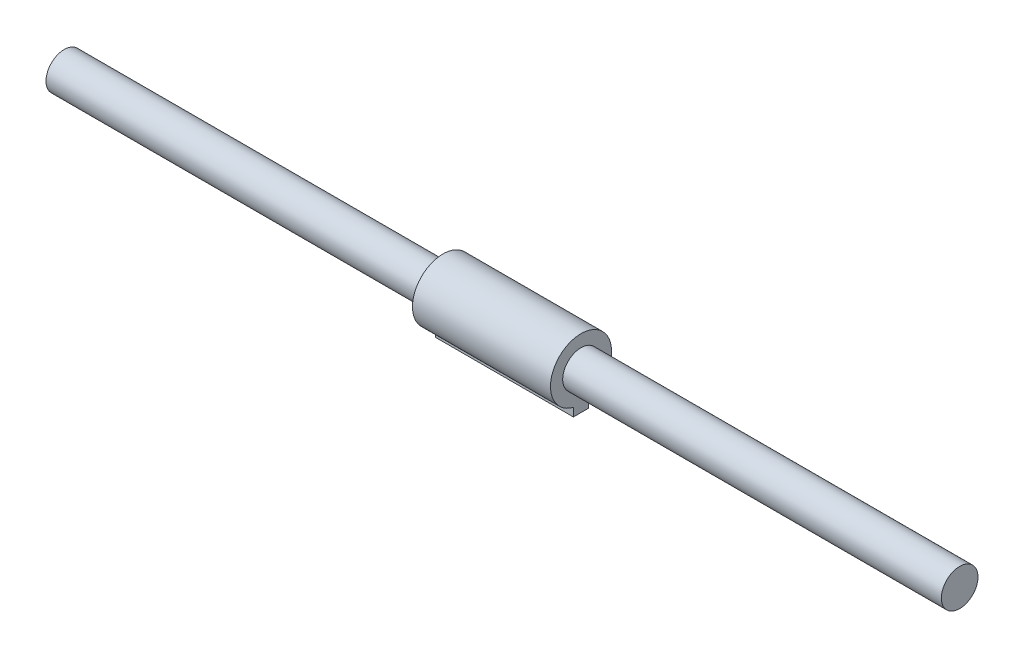
ISO-10303-21;
HEADER;
FILE_DESCRIPTION(('STEP AP214'),'2;1');
FILE_NAME('part.step','',(''),(''),'','','');
FILE_SCHEMA(('AUTOMOTIVE_DESIGN { 1 0 10303 214 1 1 1 1 }'));
ENDSEC;
DATA;
#1=APPLICATION_CONTEXT('core data for automotive mechanical design processes');
#2=APPLICATION_PROTOCOL_DEFINITION('international standard','automotive_design',2000,#1);
#3=PRODUCT_CONTEXT('',#1,'mechanical');
#4=PRODUCT('Part','Part','',(#3));
#5=PRODUCT_RELATED_PRODUCT_CATEGORY('part','',(#4));
#6=PRODUCT_DEFINITION_FORMATION('','',#4);
#7=PRODUCT_DEFINITION_CONTEXT('part definition',#1,'design');
#8=PRODUCT_DEFINITION('design','',#6,#7);
#9=PRODUCT_DEFINITION_SHAPE('','',#8);
#10=(LENGTH_UNIT() NAMED_UNIT(*) SI_UNIT(.MILLI.,.METRE.));
#11=(NAMED_UNIT(*) PLANE_ANGLE_UNIT() SI_UNIT($,.RADIAN.));
#12=(NAMED_UNIT(*) SI_UNIT($,.STERADIAN.) SOLID_ANGLE_UNIT());
#13=UNCERTAINTY_MEASURE_WITH_UNIT(LENGTH_MEASURE(1.E-05),#10,'distance_accuracy_value','');
#14=(GEOMETRIC_REPRESENTATION_CONTEXT(3) GLOBAL_UNCERTAINTY_ASSIGNED_CONTEXT((#13)) GLOBAL_UNIT_ASSIGNED_CONTEXT((#10,
#11,#12)) REPRESENTATION_CONTEXT('',''));
#15=CARTESIAN_POINT('',(0.,0.,0.));
#16=DIRECTION('',(0.,0.,1.));
#17=DIRECTION('',(1.,0.,0.));
#18=AXIS2_PLACEMENT_3D('',#15,#16,#17);
#19=CARTESIAN_POINT('',(28.702,0.,0.));
#20=DIRECTION('',(-1.,0.,0.));
#21=DIRECTION('',(0.,0.,1.));
#22=AXIS2_PLACEMENT_3D('',#19,#20,#21);
#23=CYLINDRICAL_SURFACE('',#22,6.35);
#24=CARTESIAN_POINT('',(0.,0.,0.));
#25=DIRECTION('',(1.,0.,0.));
#26=DIRECTION('',(0.,0.,-1.));
#27=AXIS2_PLACEMENT_3D('',#24,#25,#26);
#28=CIRCLE('',#27,6.35);
#29=CARTESIAN_POINT('',(0.,-6.14836106210427,-1.5875));
#30=VERTEX_POINT('',#29);
#31=CARTESIAN_POINT('',(0.,-6.14836106210427,1.5875));
#32=VERTEX_POINT('',#31);
#33=EDGE_CURVE('E101',#30,#32,#28,.T.);
#34=ORIENTED_EDGE('',*,*,#33,.T.);
#35=DIRECTION('',(-1.,0.,0.));
#36=VECTOR('',#35,1.);
#37=CARTESIAN_POINT('',(28.702,-6.14836106210427,1.5875));
#38=LINE('',#37,#36);
#39=CARTESIAN_POINT('',(28.702,-6.14836106210427,1.5875));
#40=VERTEX_POINT('',#39);
#41=EDGE_CURVE('E43',#40,#32,#38,.T.);
#42=ORIENTED_EDGE('',*,*,#41,.F.);
#43=CARTESIAN_POINT('',(28.702,0.,0.));
#44=DIRECTION('',(1.,0.,0.));
#45=DIRECTION('',(0.,0.,-1.));
#46=AXIS2_PLACEMENT_3D('',#43,#44,#45);
#47=CIRCLE('',#46,6.35);
#48=CARTESIAN_POINT('',(28.702,-6.14836106210427,-1.5875));
#49=VERTEX_POINT('',#48);
#50=EDGE_CURVE('E87',#49,#40,#47,.T.);
#51=ORIENTED_EDGE('',*,*,#50,.F.);
#52=DIRECTION('',(-1.,0.,0.));
#53=VECTOR('',#52,1.);
#54=CARTESIAN_POINT('',(28.702,-6.14836106210427,-1.5875));
#55=LINE('',#54,#53);
#56=EDGE_CURVE('E97',#49,#30,#55,.T.);
#57=ORIENTED_EDGE('',*,*,#56,.T.);
#58=EDGE_LOOP('',(#34,#42,#51,#57));
#59=FACE_BOUND('',#58,.T.);
#60=ADVANCED_FACE('F35',(#59),#23,.T.);
#61=CARTESIAN_POINT('',(28.702,-7.87302106210427,1.5875));
#62=DIRECTION('',(0.,0.,-1.));
#63=DIRECTION('',(0.,1.,0.));
#64=AXIS2_PLACEMENT_3D('',#61,#62,#63);
#65=PLANE('',#64);
#66=DIRECTION('',(0.,-1.,0.));
#67=VECTOR('',#66,1.);
#68=CARTESIAN_POINT('',(0.,-7.87302106210427,1.5875));
#69=LINE('',#68,#67);
#70=CARTESIAN_POINT('',(0.,-7.87302106210427,1.5875));
#71=VERTEX_POINT('',#70);
#72=EDGE_CURVE('E92',#32,#71,#69,.T.);
#73=ORIENTED_EDGE('',*,*,#72,.T.);
#74=DIRECTION('',(-1.,0.,0.));
#75=VECTOR('',#74,1.);
#76=CARTESIAN_POINT('',(28.702,-7.87302106210427,1.5875));
#77=LINE('',#76,#75);
#78=CARTESIAN_POINT('',(28.702,-7.87302106210427,1.5875));
#79=VERTEX_POINT('',#78);
#80=EDGE_CURVE('E90',#79,#71,#77,.T.);
#81=ORIENTED_EDGE('',*,*,#80,.F.);
#82=DIRECTION('',(0.,-1.,0.));
#83=VECTOR('',#82,1.);
#84=CARTESIAN_POINT('',(28.702,-7.87302106210427,1.5875));
#85=LINE('',#84,#83);
#86=EDGE_CURVE('E82',#40,#79,#85,.T.);
#87=ORIENTED_EDGE('',*,*,#86,.F.);
#88=ORIENTED_EDGE('',*,*,#41,.T.);
#89=EDGE_LOOP('',(#73,#81,#87,#88));
#90=FACE_BOUND('',#89,.T.);
#91=ADVANCED_FACE('F91',(#90),#65,.F.);
#92=CARTESIAN_POINT('',(28.702,-7.87302106210427,-1.5875));
#93=DIRECTION('',(0.,1.,0.));
#94=DIRECTION('',(0.,0.,1.));
#95=AXIS2_PLACEMENT_3D('',#92,#93,#94);
#96=PLANE('',#95);
#97=DIRECTION('',(0.,0.,-1.));
#98=VECTOR('',#97,1.);
#99=CARTESIAN_POINT('',(0.,-7.87302106210427,-1.5875));
#100=LINE('',#99,#98);
#101=CARTESIAN_POINT('',(0.,-7.87302106210427,-1.5875));
#102=VERTEX_POINT('',#101);
#103=EDGE_CURVE('E68',#71,#102,#100,.T.);
#104=ORIENTED_EDGE('',*,*,#103,.T.);
#105=DIRECTION('',(-1.,0.,0.));
#106=VECTOR('',#105,1.);
#107=CARTESIAN_POINT('',(28.702,-7.87302106210427,-1.5875));
#108=LINE('',#107,#106);
#109=CARTESIAN_POINT('',(28.702,-7.87302106210427,-1.5875));
#110=VERTEX_POINT('',#109);
#111=EDGE_CURVE('E93',#110,#102,#108,.T.);
#112=ORIENTED_EDGE('',*,*,#111,.F.);
#113=DIRECTION('',(0.,0.,-1.));
#114=VECTOR('',#113,1.);
#115=CARTESIAN_POINT('',(28.702,-7.87302106210427,-1.5875));
#116=LINE('',#115,#114);
#117=EDGE_CURVE('E85',#79,#110,#116,.T.);
#118=ORIENTED_EDGE('',*,*,#117,.F.);
#119=ORIENTED_EDGE('',*,*,#80,.T.);
#120=EDGE_LOOP('',(#104,#112,#118,#119));
#121=FACE_BOUND('',#120,.T.);
#122=ADVANCED_FACE('F95',(#121),#96,.F.);
#123=CARTESIAN_POINT('',(28.702,-6.14836106210427,-1.5875));
#124=DIRECTION('',(0.,0.,1.));
#125=DIRECTION('',(0.,-1.,0.));
#126=AXIS2_PLACEMENT_3D('',#123,#124,#125);
#127=PLANE('',#126);
#128=DIRECTION('',(0.,1.,0.));
#129=VECTOR('',#128,1.);
#130=CARTESIAN_POINT('',(0.,-6.14836106210427,-1.5875));
#131=LINE('',#130,#129);
#132=EDGE_CURVE('E74',#102,#30,#131,.T.);
#133=ORIENTED_EDGE('',*,*,#132,.T.);
#134=ORIENTED_EDGE('',*,*,#56,.F.);
#135=DIRECTION('',(0.,1.,0.));
#136=VECTOR('',#135,1.);
#137=CARTESIAN_POINT('',(28.702,-6.14836106210427,-1.5875));
#138=LINE('',#137,#136);
#139=EDGE_CURVE('E51',#110,#49,#138,.T.);
#140=ORIENTED_EDGE('',*,*,#139,.F.);
#141=ORIENTED_EDGE('',*,*,#111,.T.);
#142=EDGE_LOOP('',(#133,#134,#140,#141));
#143=FACE_BOUND('',#142,.T.);
#144=ADVANCED_FACE('F124',(#143),#127,.F.);
#145=CARTESIAN_POINT('',(28.702,0.,0.));
#146=DIRECTION('',(1.,0.,0.));
#147=DIRECTION('',(0.,0.,-1.));
#148=AXIS2_PLACEMENT_3D('',#145,#146,#147);
#149=PLANE('',#148);
#150=CARTESIAN_POINT('',(28.702,0.,0.));
#151=DIRECTION('',(1.,0.,0.));
#152=DIRECTION('',(0.,0.,-1.));
#153=AXIS2_PLACEMENT_3D('',#150,#151,#152);
#154=CIRCLE('',#153,3.81);
#155=CARTESIAN_POINT('',(28.702,0.,-3.81));
#156=VERTEX_POINT('',#155);
#157=EDGE_CURVE('E198',#156,#156,#154,.T.);
#158=ORIENTED_EDGE('',*,*,#157,.F.);
#159=EDGE_LOOP('',(#158));
#160=FACE_BOUND('',#159,.T.);
#161=ORIENTED_EDGE('',*,*,#50,.T.);
#162=ORIENTED_EDGE('',*,*,#86,.T.);
#163=ORIENTED_EDGE('',*,*,#117,.T.);
#164=ORIENTED_EDGE('',*,*,#139,.T.);
#165=EDGE_LOOP('',(#161,#162,#163,#164));
#166=FACE_BOUND('',#165,.T.);
#167=ADVANCED_FACE('F83',(#160,#166),#149,.T.);
#168=CARTESIAN_POINT('',(0.,0.,0.));
#169=DIRECTION('',(1.,0.,0.));
#170=DIRECTION('',(0.,0.,-1.));
#171=AXIS2_PLACEMENT_3D('',#168,#169,#170);
#172=PLANE('',#171);
#173=CARTESIAN_POINT('',(0.,0.,0.));
#174=DIRECTION('',(1.,0.,0.));
#175=DIRECTION('',(0.,0.,-1.));
#176=AXIS2_PLACEMENT_3D('',#173,#174,#175);
#177=CIRCLE('',#176,3.81);
#178=CARTESIAN_POINT('',(0.,0.,-3.81));
#179=VERTEX_POINT('',#178);
#180=EDGE_CURVE('E11',#179,#179,#177,.F.);
#181=ORIENTED_EDGE('',*,*,#180,.F.);
#182=EDGE_LOOP('',(#181));
#183=FACE_BOUND('',#182,.T.);
#184=ORIENTED_EDGE('',*,*,#33,.F.);
#185=ORIENTED_EDGE('',*,*,#132,.F.);
#186=ORIENTED_EDGE('',*,*,#103,.F.);
#187=ORIENTED_EDGE('',*,*,#72,.F.);
#188=EDGE_LOOP('',(#184,#185,#186,#187));
#189=FACE_BOUND('',#188,.T.);
#190=ADVANCED_FACE('F112',(#183,#189),#172,.F.);
#191=CARTESIAN_POINT('',(107.442,0.,0.));
#192=DIRECTION('',(-1.,0.,0.));
#193=DIRECTION('',(0.,0.,1.));
#194=AXIS2_PLACEMENT_3D('',#191,#192,#193);
#195=CYLINDRICAL_SURFACE('',#194,3.81);
#196=CARTESIAN_POINT('',(107.442,0.,0.));
#197=DIRECTION('',(1.,0.,0.));
#198=DIRECTION('',(0.,0.,-1.));
#199=AXIS2_PLACEMENT_3D('',#196,#197,#198);
#200=CIRCLE('',#199,3.81);
#201=CARTESIAN_POINT('',(107.442,0.,-3.81));
#202=VERTEX_POINT('',#201);
#203=EDGE_CURVE('E104',#202,#202,#200,.T.);
#204=ORIENTED_EDGE('',*,*,#203,.F.);
#205=EDGE_LOOP('',(#204));
#206=FACE_BOUND('',#205,.T.);
#207=ORIENTED_EDGE('',*,*,#157,.T.);
#208=EDGE_LOOP('',(#207));
#209=FACE_BOUND('',#208,.T.);
#210=ADVANCED_FACE('F114',(#206,#209),#195,.T.);
#211=CARTESIAN_POINT('',(107.442,0.,0.));
#212=DIRECTION('',(1.,0.,0.));
#213=DIRECTION('',(0.,0.,-1.));
#214=AXIS2_PLACEMENT_3D('',#211,#212,#213);
#215=PLANE('',#214);
#216=ORIENTED_EDGE('',*,*,#203,.T.);
#217=EDGE_LOOP('',(#216));
#218=FACE_BOUND('',#217,.T.);
#219=ADVANCED_FACE('F121',(#218),#215,.T.);
#220=CARTESIAN_POINT('',(-78.74,0.,0.));
#221=DIRECTION('',(1.,0.,0.));
#222=DIRECTION('',(0.,0.,-1.));
#223=AXIS2_PLACEMENT_3D('',#220,#221,#222);
#224=CYLINDRICAL_SURFACE('',#223,3.81);
#225=CARTESIAN_POINT('',(-78.74,0.,0.));
#226=DIRECTION('',(-1.,0.,0.));
#227=DIRECTION('',(0.,0.,1.));
#228=AXIS2_PLACEMENT_3D('',#225,#226,#227);
#229=CIRCLE('',#228,3.81);
#230=CARTESIAN_POINT('',(-78.74,0.,3.81));
#231=VERTEX_POINT('',#230);
#232=EDGE_CURVE('E197',#231,#231,#229,.T.);
#233=ORIENTED_EDGE('',*,*,#232,.F.);
#234=EDGE_LOOP('',(#233));
#235=FACE_BOUND('',#234,.T.);
#236=ORIENTED_EDGE('',*,*,#180,.T.);
#237=EDGE_LOOP('',(#236));
#238=FACE_BOUND('',#237,.T.);
#239=ADVANCED_FACE('F163',(#235,#238),#224,.T.);
#240=CARTESIAN_POINT('',(-78.74,0.,0.));
#241=DIRECTION('',(-1.,0.,0.));
#242=DIRECTION('',(0.,0.,1.));
#243=AXIS2_PLACEMENT_3D('',#240,#241,#242);
#244=PLANE('',#243);
#245=ORIENTED_EDGE('',*,*,#232,.T.);
#246=EDGE_LOOP('',(#245));
#247=FACE_BOUND('',#246,.T.);
#248=ADVANCED_FACE('F178',(#247),#244,.T.);
#249=CLOSED_SHELL('',(#60,#91,#122,#144,#167,#190,#210,#219,#239,#248));
#250=MANIFOLD_SOLID_BREP('B2',#249);
#251=ADVANCED_BREP_SHAPE_REPRESENTATION('',(#18,#250),#14);
#252=SHAPE_DEFINITION_REPRESENTATION(#9,#251);
ENDSEC;
END-ISO-10303-21;
